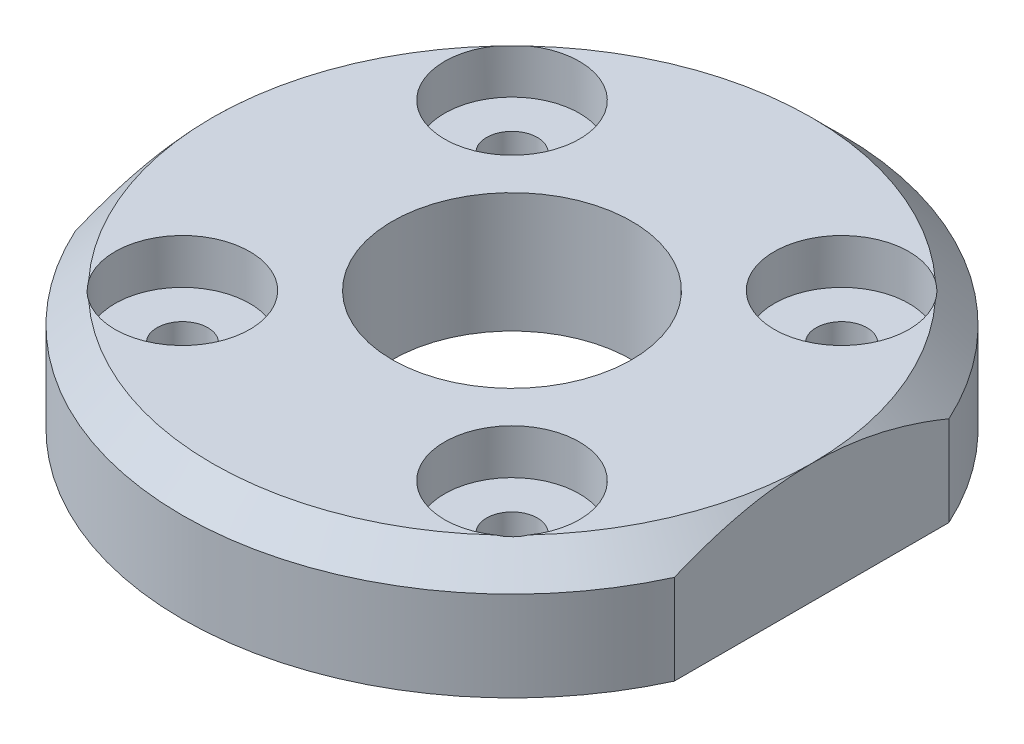
ISO-10303-21;
HEADER;
FILE_DESCRIPTION(('STEP AP214'),'2;1');
FILE_NAME('part.step','',(''),(''),'','','');
FILE_SCHEMA(('AUTOMOTIVE_DESIGN { 1 0 10303 214 1 1 1 1 }'));
ENDSEC;
DATA;
#1=APPLICATION_CONTEXT('core data for automotive mechanical design processes');
#2=APPLICATION_PROTOCOL_DEFINITION('international standard','automotive_design',2000,#1);
#3=PRODUCT_CONTEXT('',#1,'mechanical');
#4=PRODUCT('Part','Part','',(#3));
#5=PRODUCT_RELATED_PRODUCT_CATEGORY('part','',(#4));
#6=PRODUCT_DEFINITION_FORMATION('','',#4);
#7=PRODUCT_DEFINITION_CONTEXT('part definition',#1,'design');
#8=PRODUCT_DEFINITION('design','',#6,#7);
#9=PRODUCT_DEFINITION_SHAPE('','',#8);
#10=(LENGTH_UNIT() NAMED_UNIT(*) SI_UNIT(.MILLI.,.METRE.));
#11=(NAMED_UNIT(*) PLANE_ANGLE_UNIT() SI_UNIT($,.RADIAN.));
#12=(NAMED_UNIT(*) SI_UNIT($,.STERADIAN.) SOLID_ANGLE_UNIT());
#13=UNCERTAINTY_MEASURE_WITH_UNIT(LENGTH_MEASURE(1.E-05),#10,'distance_accuracy_value','');
#14=(GEOMETRIC_REPRESENTATION_CONTEXT(3) GLOBAL_UNCERTAINTY_ASSIGNED_CONTEXT((#13)) GLOBAL_UNIT_ASSIGNED_CONTEXT((#10,
#11,#12)) REPRESENTATION_CONTEXT('',''));
#15=CARTESIAN_POINT('',(0.,0.,0.));
#16=DIRECTION('',(0.,0.,1.));
#17=DIRECTION('',(1.,0.,0.));
#18=AXIS2_PLACEMENT_3D('',#15,#16,#17);
#19=CARTESIAN_POINT('',(0.,0.,0.));
#20=DIRECTION('',(0.,1.,0.));
#21=DIRECTION('',(0.,0.,1.));
#22=AXIS2_PLACEMENT_3D('',#19,#20,#21);
#23=PLANE('',#22);
#24=CARTESIAN_POINT('',(-11.,0.,-11.));
#25=DIRECTION('',(0.,1.,0.));
#26=DIRECTION('',(0.,0.,1.));
#27=AXIS2_PLACEMENT_3D('',#24,#25,#26);
#28=CIRCLE('',#27,1.7);
#29=CARTESIAN_POINT('',(-11.,0.,-9.3));
#30=VERTEX_POINT('',#29);
#31=EDGE_CURVE('E210',#30,#30,#28,.T.);
#32=ORIENTED_EDGE('',*,*,#31,.T.);
#33=EDGE_LOOP('',(#32));
#34=FACE_BOUND('',#33,.T.);
#35=CARTESIAN_POINT('',(11.,0.,-11.));
#36=DIRECTION('',(0.,1.,0.));
#37=DIRECTION('',(0.,0.,1.));
#38=AXIS2_PLACEMENT_3D('',#35,#36,#37);
#39=CIRCLE('',#38,1.7);
#40=CARTESIAN_POINT('',(11.,0.,-9.3));
#41=VERTEX_POINT('',#40);
#42=EDGE_CURVE('E220',#41,#41,#39,.T.);
#43=ORIENTED_EDGE('',*,*,#42,.T.);
#44=EDGE_LOOP('',(#43));
#45=FACE_BOUND('',#44,.T.);
#46=CARTESIAN_POINT('',(11.,0.,11.));
#47=DIRECTION('',(0.,1.,0.));
#48=DIRECTION('',(0.,0.,1.));
#49=AXIS2_PLACEMENT_3D('',#46,#47,#48);
#50=CIRCLE('',#49,1.7);
#51=CARTESIAN_POINT('',(11.,0.,12.7));
#52=VERTEX_POINT('',#51);
#53=EDGE_CURVE('E229',#52,#52,#50,.T.);
#54=ORIENTED_EDGE('',*,*,#53,.T.);
#55=EDGE_LOOP('',(#54));
#56=FACE_BOUND('',#55,.T.);
#57=CARTESIAN_POINT('',(-11.,0.,11.));
#58=DIRECTION('',(0.,1.,0.));
#59=DIRECTION('',(0.,0.,1.));
#60=AXIS2_PLACEMENT_3D('',#57,#58,#59);
#61=CIRCLE('',#60,1.7);
#62=CARTESIAN_POINT('',(-11.,0.,12.7));
#63=VERTEX_POINT('',#62);
#64=EDGE_CURVE('E157',#63,#63,#61,.T.);
#65=ORIENTED_EDGE('',*,*,#64,.T.);
#66=EDGE_LOOP('',(#65));
#67=FACE_BOUND('',#66,.T.);
#68=CARTESIAN_POINT('',(0.,0.,0.));
#69=DIRECTION('',(0.,1.,0.));
#70=DIRECTION('',(0.,0.,1.));
#71=AXIS2_PLACEMENT_3D('',#68,#69,#70);
#72=CIRCLE('',#71,8.);
#73=CARTESIAN_POINT('',(0.,0.,8.));
#74=VERTEX_POINT('',#73);
#75=EDGE_CURVE('E141',#74,#74,#72,.T.);
#76=ORIENTED_EDGE('',*,*,#75,.T.);
#77=EDGE_LOOP('',(#76));
#78=FACE_BOUND('',#77,.T.);
#79=DIRECTION('',(0.,0.,-1.));
#80=VECTOR('',#79,1.);
#81=CARTESIAN_POINT('',(-20.,0.,-27.1326164874552));
#82=LINE('',#81,#80);
#83=CARTESIAN_POINT('',(-20.,0.,9.16515138991169));
#84=VERTEX_POINT('',#83);
#85=CARTESIAN_POINT('',(-20.,0.,-9.16515138991169));
#86=VERTEX_POINT('',#85);
#87=EDGE_CURVE('E120',#84,#86,#82,.T.);
#88=ORIENTED_EDGE('',*,*,#87,.T.);
#89=CARTESIAN_POINT('',(0.,0.,0.));
#90=DIRECTION('',(0.,1.,0.));
#91=DIRECTION('',(0.,0.,1.));
#92=AXIS2_PLACEMENT_3D('',#89,#90,#91);
#93=CIRCLE('',#92,22.);
#94=CARTESIAN_POINT('',(20.,0.,-9.16515138991167));
#95=VERTEX_POINT('',#94);
#96=EDGE_CURVE('E127',#95,#86,#93,.T.);
#97=ORIENTED_EDGE('',*,*,#96,.F.);
#98=DIRECTION('',(0.,0.,1.));
#99=VECTOR('',#98,1.);
#100=CARTESIAN_POINT('',(20.,0.,-27.1326164874552));
#101=LINE('',#100,#99);
#102=CARTESIAN_POINT('',(20.,0.,9.16515138991167));
#103=VERTEX_POINT('',#102);
#104=EDGE_CURVE('E112',#95,#103,#101,.T.);
#105=ORIENTED_EDGE('',*,*,#104,.T.);
#106=EDGE_CURVE('E133',#84,#103,#93,.T.);
#107=ORIENTED_EDGE('',*,*,#106,.F.);
#108=EDGE_LOOP('',(#88,#97,#105,#107));
#109=FACE_BOUND('',#108,.T.);
#110=ADVANCED_FACE('F37',(#34,#45,#56,#67,#78,#109),#23,.F.);
#111=CARTESIAN_POINT('',(0.,8.,0.));
#112=DIRECTION('',(0.,-1.,0.));
#113=DIRECTION('',(0.,0.,-1.));
#114=AXIS2_PLACEMENT_3D('',#111,#112,#113);
#115=CYLINDRICAL_SURFACE('',#114,22.);
#116=DIRECTION('',(0.,-1.,0.));
#117=VECTOR('',#116,1.);
#118=CARTESIAN_POINT('',(-20.,8.,-9.16515138991168));
#119=LINE('',#118,#117);
#120=CARTESIAN_POINT('',(-20.,6.00000000000001,-9.16515138991168));
#121=VERTEX_POINT('',#120);
#122=EDGE_CURVE('E197',#121,#86,#119,.T.);
#123=ORIENTED_EDGE('',*,*,#122,.F.);
#124=CARTESIAN_POINT('',(0.,6.00000000000001,0.));
#125=DIRECTION('',(0.,1.,0.));
#126=DIRECTION('',(0.,0.,1.));
#127=AXIS2_PLACEMENT_3D('',#124,#125,#126);
#128=CIRCLE('',#127,22.);
#129=CARTESIAN_POINT('',(20.,6.00000000000001,-9.16515138991167));
#130=VERTEX_POINT('',#129);
#131=EDGE_CURVE('E129',#121,#130,#128,.F.);
#132=ORIENTED_EDGE('',*,*,#131,.T.);
#133=DIRECTION('',(0.,-1.,0.));
#134=VECTOR('',#133,1.);
#135=CARTESIAN_POINT('',(20.,8.,-9.16515138991167));
#136=LINE('',#135,#134);
#137=EDGE_CURVE('E58',#95,#130,#136,.F.);
#138=ORIENTED_EDGE('',*,*,#137,.F.);
#139=ORIENTED_EDGE('',*,*,#96,.T.);
#140=EDGE_LOOP('',(#123,#132,#138,#139));
#141=FACE_BOUND('',#140,.T.);
#142=ADVANCED_FACE('F126',(#141),#115,.T.);
#143=DIRECTION('',(0.,-1.,0.));
#144=VECTOR('',#143,1.);
#145=CARTESIAN_POINT('',(-20.,8.,9.16515138991168));
#146=LINE('',#145,#144);
#147=CARTESIAN_POINT('',(-20.,6.00000000000001,9.16515138991168));
#148=VERTEX_POINT('',#147);
#149=EDGE_CURVE('E66',#84,#148,#146,.F.);
#150=ORIENTED_EDGE('',*,*,#149,.F.);
#151=ORIENTED_EDGE('',*,*,#106,.T.);
#152=DIRECTION('',(0.,-1.,0.));
#153=VECTOR('',#152,1.);
#154=CARTESIAN_POINT('',(20.,8.,9.16515138991167));
#155=LINE('',#154,#153);
#156=CARTESIAN_POINT('',(20.,6.00000000000002,9.16515138991167));
#157=VERTEX_POINT('',#156);
#158=EDGE_CURVE('E115',#157,#103,#155,.T.);
#159=ORIENTED_EDGE('',*,*,#158,.F.);
#160=EDGE_CURVE('E145',#157,#148,#128,.F.);
#161=ORIENTED_EDGE('',*,*,#160,.T.);
#162=EDGE_LOOP('',(#150,#151,#159,#161));
#163=FACE_BOUND('',#162,.T.);
#164=ADVANCED_FACE('F187',(#163),#115,.T.);
#165=CARTESIAN_POINT('',(0.,8.,0.));
#166=DIRECTION('',(0.,-1.,0.));
#167=DIRECTION('',(0.,0.,-1.));
#168=AXIS2_PLACEMENT_3D('',#165,#166,#167);
#169=CONICAL_SURFACE('',#168,20.,0.785398163397448);
#170=ORIENTED_EDGE('',*,*,#131,.F.);
#171=CARTESIAN_POINT('',(-20.,2.89207263716591,-15.1791968317613));
#172=CARTESIAN_POINT('',(-20.,3.11743132341118,-14.806376874501));
#173=CARTESIAN_POINT('',(-20.,3.33899370684409,-14.4312261788306));
#174=CARTESIAN_POINT('',(-20.,3.77335041971191,-13.6757640024392));
#175=CARTESIAN_POINT('',(-20.,3.98614255033087,-13.2954512589154));
#176=CARTESIAN_POINT('',(-20.,4.40254146675204,-12.5277439442489));
#177=CARTESIAN_POINT('',(-20.,4.60610596805788,-12.1403263550201));
#178=CARTESIAN_POINT('',(-20.,5.00157857932182,-11.3596083907334));
#179=CARTESIAN_POINT('',(-20.,5.19348745879363,-10.9663084061773));
#180=CARTESIAN_POINT('',(-20.,5.56752592857174,-10.1657987573753));
#181=CARTESIAN_POINT('',(-20.,5.74939622406038,-9.75846706894974));
#182=CARTESIAN_POINT('',(-20.,6.09720282389024,-8.93706222695268));
#183=CARTESIAN_POINT('',(-20.,6.26313771782975,-8.5229884804451));
#184=CARTESIAN_POINT('',(-20.,6.73308142143161,-7.27173018647817));
#185=CARTESIAN_POINT('',(-20.,7.01000167406303,-6.42389528703828));
#186=CARTESIAN_POINT('',(-20.,7.37404837860108,-5.06560721031782));
#187=CARTESIAN_POINT('',(-20.,7.49200460306922,-4.56331615536337));
#188=CARTESIAN_POINT('',(-20.,7.69313272789396,-3.55167088583208));
#189=CARTESIAN_POINT('',(-20.,7.77630293768696,-3.04231632921907));
#190=CARTESIAN_POINT('',(-20.,7.90419964888527,-2.0234405535724));
#191=CARTESIAN_POINT('',(-20.,7.94926593859624,-1.51396222667464));
#192=CARTESIAN_POINT('',(-20.,8.00041845914456,-0.49297071485993));
#193=CARTESIAN_POINT('',(-20.,8.00650378913915,0.0185425168099394));
#194=CARTESIAN_POINT('',(-20.,7.98510461044872,0.827765351388666));
#195=CARTESIAN_POINT('',(-20.,7.97053503985032,1.1258746258079));
#196=CARTESIAN_POINT('',(-20.,7.92827248720929,1.72116554828182));
#197=CARTESIAN_POINT('',(-20.,7.90057912008296,2.01834716885933));
#198=CARTESIAN_POINT('',(-20.,7.79830237238332,2.90773928855317));
#199=CARTESIAN_POINT('',(-20.,7.70452144626838,3.49782873224832));
#200=CARTESIAN_POINT('',(-20.,7.46887683999057,4.67599997680544));
#201=CARTESIAN_POINT('',(-20.,7.32641119486252,5.26395869768148));
#202=CARTESIAN_POINT('',(-20.,6.99984743435779,6.42794961505244));
#203=CARTESIAN_POINT('',(-20.,6.81575685714171,7.00398395042867));
#204=CARTESIAN_POINT('',(-20.,6.37223005198841,8.25641336359949));
#205=CARTESIAN_POINT('',(-20.,6.10509181411185,8.93006187562903));
#206=CARTESIAN_POINT('',(-20.,5.52992418999876,10.2598262229413));
#207=CARTESIAN_POINT('',(-20.,5.22187482773227,10.9159333038991));
#208=CARTESIAN_POINT('',(-20.,4.57217165041683,12.2139206594634));
#209=CARTESIAN_POINT('',(-20.,4.23040843943256,12.8557457468395));
#210=CARTESIAN_POINT('',(-20.,3.52086379818624,14.1246124924728));
#211=CARTESIAN_POINT('',(-20.,3.15308666669254,14.7516565705467));
#212=CARTESIAN_POINT('',(-20.,2.41327644768557,15.9656383822411));
#213=CARTESIAN_POINT('',(-20.,2.04214249986242,16.5531268948496));
#214=CARTESIAN_POINT('',(-20.,1.28425592323255,17.7179732206919));
#215=CARTESIAN_POINT('',(-20.,0.897502047959991,18.2953302201391));
#216=CARTESIAN_POINT('',(-20.,0.114416522547853,19.4364748216122));
#217=CARTESIAN_POINT('',(-20.,-0.28180934436011,20.0003351865517));
#218=CARTESIAN_POINT('',(-20.,-0.883967717553222,20.8403843532339));
#219=CARTESIAN_POINT('',(-20.,-1.0859634761424,21.119407685346));
#220=CARTESIAN_POINT('',(-20.,-1.49236180998181,21.6756877501043));
#221=CARTESIAN_POINT('',(-20.,-1.69676433603197,21.9529445186854));
#222=CARTESIAN_POINT('',(-20.,-1.90226644929818,22.2293845799839));
#223=B_SPLINE_CURVE_WITH_KNOTS('',3,(#171,#172,#173,#174,#175,#176,#177,#178,#179,#180,#181,
#182,#183,#184,#185,#186,#187,#188,#189,#190,#191,#192,#193,#194,#195,#196,#197,#198,#199,#200,
#201,#202,#203,#204,#205,#206,#207,#208,#209,#210,#211,#212,#213,#214,#215,#216,#217,#218,#219,
#220,#221,#222),.UNSPECIFIED.,.F.,.F.,(4,2,2,2,2,2,2,2,2,2,2,2,2,2,2,2,2,2,2,2,2,2,2,2,2,4),(0.,
1.3069393903593,2.61420447851268,3.92695440804231,5.23961757432271,6.57754409800536,
7.91558892922459,10.5863271586001,12.1331904331278,13.6801288748451,15.2131226071205,
16.7461517664696,17.6412801011057,18.5364347025831,20.3266491372566,22.1398516362127,
23.9527260318109,26.1250476477894,28.2984338888766,30.4791201389371,32.6594468713818,
34.7438474979137,36.8284147889654,38.8957265547773,39.9291118473825,40.9624760516718),.UNSPECIFIED.);
#224=CARTESIAN_POINT('',(-20.,8.00000000000001,0.));
#225=VERTEX_POINT('',#224);
#226=EDGE_CURVE('E12',#121,#225,#223,.T.);
#227=ORIENTED_EDGE('',*,*,#226,.T.);
#228=CARTESIAN_POINT('',(0.,8.,0.));
#229=DIRECTION('',(0.,1.,0.));
#230=DIRECTION('',(0.,0.,1.));
#231=AXIS2_PLACEMENT_3D('',#228,#229,#230);
#232=CIRCLE('',#231,20.);
#233=CARTESIAN_POINT('',(-14.6997436367092,8.,-13.5616199996544));
#234=VERTEX_POINT('',#233);
#235=EDGE_CURVE('E135',#234,#225,#232,.T.);
#236=ORIENTED_EDGE('',*,*,#235,.F.);
#237=CARTESIAN_POINT('',(-12.5564186621504,8.2672570903301,-15.2222696441736));
#238=CARTESIAN_POINT('',(-12.6429099786499,8.23681051057182,-15.1903971363521));
#239=CARTESIAN_POINT('',(-12.7290204820913,8.20826101278789,-15.1556265698283));
#240=CARTESIAN_POINT('',(-12.8999797576403,8.15518471659068,-15.0802921551357));
#241=CARTESIAN_POINT('',(-12.9848279977951,8.1306595727931,-15.03972593684));
#242=CARTESIAN_POINT('',(-13.1529385836893,8.08581980154273,-14.95270096749));
#243=CARTESIAN_POINT('',(-13.2361955084826,8.06551781723818,-14.9062251752055));
#244=CARTESIAN_POINT('',(-13.4002794886541,8.02942974860471,-14.8076000497793));
#245=CARTESIAN_POINT('',(-13.4811068915129,8.01364301570865,-14.7554515329502));
#246=CARTESIAN_POINT('',(-13.6426793238895,7.98626411982456,-14.6436583626195));
#247=CARTESIAN_POINT('',(-13.7233126857109,7.97484696376055,-14.5838089741521));
#248=CARTESIAN_POINT('',(-13.8807294403846,7.95719438098347,-14.4585423270114));
#249=CARTESIAN_POINT('',(-13.9575129403414,7.95095881004159,-14.3931252233705));
#250=CARTESIAN_POINT('',(-14.1064391224374,7.943758600589,-14.2573247953016));
#251=CARTESIAN_POINT('',(-14.1785936767192,7.94277989780442,-14.186955232901));
#252=CARTESIAN_POINT('',(-14.3179297942188,7.94606877472912,-14.0416226783286));
#253=CARTESIAN_POINT('',(-14.3851136757151,7.95033389220439,-13.9666618576798));
#254=CARTESIAN_POINT('',(-14.4940682372063,7.96191937486555,-13.8365978697961));
#255=CARTESIAN_POINT('',(-14.5372560376752,7.96788112232982,-13.7825501028817));
#256=CARTESIAN_POINT('',(-14.6209448276274,7.98223145353413,-13.672737274714));
#257=CARTESIAN_POINT('',(-14.6614461385265,7.99061974631249,-13.6169724200688));
#258=CARTESIAN_POINT('',(-14.7656844045199,8.01615031141279,-13.4663151747607));
#259=CARTESIAN_POINT('',(-14.826964963451,8.03540467066666,-13.3700606197481));
#260=CARTESIAN_POINT('',(-14.9415139828214,8.08022966946816,-13.1742473451747));
#261=CARTESIAN_POINT('',(-14.9947768525579,8.10580468385547,-13.0746863785737));
#262=CARTESIAN_POINT('',(-15.0932785258516,8.163000982069,-12.8728901341668));
#263=CARTESIAN_POINT('',(-15.1384880486998,8.1946434944,-12.7706465882557));
#264=CARTESIAN_POINT('',(-15.2206566586128,8.26349651468595,-12.5647244212822));
#265=CARTESIAN_POINT('',(-15.2576131750094,8.30070875150192,-12.4610453637326));
#266=CARTESIAN_POINT('',(-15.3397040142605,8.40001111541401,-12.2014791416151));
#267=CARTESIAN_POINT('',(-15.3798143172906,8.46529080370895,-12.0451826984376));
#268=CARTESIAN_POINT('',(-15.4268085092359,8.57041865937451,-11.8121647459587));
#269=CARTESIAN_POINT('',(-15.4402557183851,8.60653520499017,-11.7349755953356));
#270=CARTESIAN_POINT('',(-15.4629944615008,8.68104181865556,-11.581130877084));
#271=CARTESIAN_POINT('',(-15.4722880841413,8.71943073299773,-11.5044750603979));
#272=CARTESIAN_POINT('',(-15.4795846495135,8.7588879710755,-11.4281604463785));
#273=B_SPLINE_CURVE_WITH_KNOTS('',3,(#237,#238,#239,#240,#241,#242,#243,#244,#245,#246,#247,
#248,#249,#250,#251,#252,#253,#254,#255,#256,#257,#258,#259,#260,#261,#262,#263,#264,#265,#266,
#267,#268,#269,#270,#271,#272),.UNSPECIFIED.,.F.,.F.,(4,2,2,2,2,2,2,2,2,2,2,2,2,2,2,2,2,4),(0.,
0.291189268640532,0.582497961569495,0.874666596718346,1.16679324389424,1.46963019947963,
1.77245872535137,2.07447665593232,2.37635282824202,2.5845619663566,2.79274614891533,
3.13935518990139,3.48620481144049,3.83429086864788,4.18248519786473,4.70324102413884,
4.96196186236162,5.22055245334422),.UNSPECIFIED.);
#274=CARTESIAN_POINT('',(-13.5616199996544,8.,-14.6997436367092));
#275=VERTEX_POINT('',#274);
#276=EDGE_CURVE('E272',#275,#234,#273,.T.);
#277=ORIENTED_EDGE('',*,*,#276,.F.);
#278=CARTESIAN_POINT('',(13.5616199996544,8.,-14.6997436367092));
#279=VERTEX_POINT('',#278);
#280=EDGE_CURVE('E461',#279,#275,#232,.T.);
#281=ORIENTED_EDGE('',*,*,#280,.F.);
#282=CARTESIAN_POINT('',(15.2222696441736,8.26725709033009,-12.5564186621504));
#283=CARTESIAN_POINT('',(15.1903971363521,8.23681051057182,-12.6429099786499));
#284=CARTESIAN_POINT('',(15.1556265698283,8.20826101278789,-12.7290204820913));
#285=CARTESIAN_POINT('',(15.0802921551357,8.15518471659068,-12.8999797576403));
#286=CARTESIAN_POINT('',(15.03972593684,8.13065957279311,-12.9848279977951));
#287=CARTESIAN_POINT('',(14.95270096749,8.08581980154273,-13.1529385836893));
#288=CARTESIAN_POINT('',(14.9062251752055,8.06551781723818,-13.2361955084826));
#289=CARTESIAN_POINT('',(14.8076000497794,8.02942974860472,-13.4002794886541));
#290=CARTESIAN_POINT('',(14.7554515329502,8.01364301570866,-13.4811068915129));
#291=CARTESIAN_POINT('',(14.6436583626195,7.98626411982456,-13.6426793238895));
#292=CARTESIAN_POINT('',(14.5838089741521,7.97484696376055,-13.7233126857109));
#293=CARTESIAN_POINT('',(14.4585423270114,7.95719438098347,-13.8807294403845));
#294=CARTESIAN_POINT('',(14.3931252233705,7.95095881004158,-13.9575129403413));
#295=CARTESIAN_POINT('',(14.2573247953016,7.943758600589,-14.1064391224374));
#296=CARTESIAN_POINT('',(14.186955232901,7.94277989780442,-14.1785936767192));
#297=CARTESIAN_POINT('',(14.0416226783287,7.94606877472912,-14.3179297942188));
#298=CARTESIAN_POINT('',(13.9666618576798,7.95033389220439,-14.385113675715));
#299=CARTESIAN_POINT('',(13.8365978697962,7.96191937486555,-14.4940682372063));
#300=CARTESIAN_POINT('',(13.7825501028817,7.96788112232981,-14.5372560376752));
#301=CARTESIAN_POINT('',(13.672737274714,7.98223145353412,-14.6209448276274));
#302=CARTESIAN_POINT('',(13.6169724200688,7.99061974631249,-14.6614461385265));
#303=CARTESIAN_POINT('',(13.4663151747607,8.01615031141279,-14.7656844045199));
#304=CARTESIAN_POINT('',(13.370060619748,8.03540467066666,-14.8269649634511));
#305=CARTESIAN_POINT('',(13.1742473451747,8.08022966946816,-14.9415139828214));
#306=CARTESIAN_POINT('',(13.0746863785737,8.10580468385548,-14.9947768525579));
#307=CARTESIAN_POINT('',(12.8728901341668,8.16300098206901,-15.0932785258517));
#308=CARTESIAN_POINT('',(12.7706465882556,8.1946434944,-15.1384880486998));
#309=CARTESIAN_POINT('',(12.5647244212821,8.26349651468595,-15.2206566586129));
#310=CARTESIAN_POINT('',(12.4610453637325,8.30070875150192,-15.2576131750094));
#311=CARTESIAN_POINT('',(12.2014791416151,8.40001111541401,-15.3397040142605));
#312=CARTESIAN_POINT('',(12.0451826984375,8.46529080370895,-15.3798143172906));
#313=CARTESIAN_POINT('',(11.8121647459587,8.5704186593745,-15.4268085092359));
#314=CARTESIAN_POINT('',(11.7349755953356,8.60653520499017,-15.4402557183851));
#315=CARTESIAN_POINT('',(11.581130877084,8.68104181865556,-15.4629944615008));
#316=CARTESIAN_POINT('',(11.5044750603979,8.71943073299773,-15.4722880841413));
#317=CARTESIAN_POINT('',(11.4281604463785,8.7588879710755,-15.4795846495135));
#318=B_SPLINE_CURVE_WITH_KNOTS('',3,(#282,#283,#284,#285,#286,#287,#288,#289,#290,#291,#292,
#293,#294,#295,#296,#297,#298,#299,#300,#301,#302,#303,#304,#305,#306,#307,#308,#309,#310,#311,
#312,#313,#314,#315,#316,#317),.UNSPECIFIED.,.F.,.F.,(4,2,2,2,2,2,2,2,2,2,2,2,2,2,2,2,2,4),(0.,
0.291189268640524,0.582497961569483,0.87466659671833,1.16679324389422,1.46963019947961,
1.77245872535134,2.07447665593229,2.37635282824199,2.5845619663566,2.79274614891535,
3.13935518990141,3.48620481144051,3.8342908686479,4.18248519786475,4.70324102413885,
4.96196186236163,5.22055245334422),.UNSPECIFIED.);
#319=CARTESIAN_POINT('',(14.6997436367092,8.,-13.5616199996544));
#320=VERTEX_POINT('',#319);
#321=EDGE_CURVE('E265',#320,#279,#318,.T.);
#322=ORIENTED_EDGE('',*,*,#321,.F.);
#323=CARTESIAN_POINT('',(20.,8.00000000000001,0.));
#324=VERTEX_POINT('',#323);
#325=EDGE_CURVE('E137',#324,#320,#232,.T.);
#326=ORIENTED_EDGE('',*,*,#325,.F.);
#327=CARTESIAN_POINT('',(20.,2.89207263716591,-15.1791968317613));
#328=CARTESIAN_POINT('',(20.,3.11743132341117,-14.806376874501));
#329=CARTESIAN_POINT('',(20.,3.33899370684408,-14.4312261788306));
#330=CARTESIAN_POINT('',(20.,3.77335041971191,-13.6757640024392));
#331=CARTESIAN_POINT('',(20.,3.98614255033087,-13.2954512589154));
#332=CARTESIAN_POINT('',(20.,4.40254146675204,-12.5277439442489));
#333=CARTESIAN_POINT('',(20.,4.60610596805787,-12.1403263550201));
#334=CARTESIAN_POINT('',(20.,5.00157857932182,-11.3596083907334));
#335=CARTESIAN_POINT('',(20.,5.19348745879363,-10.9663084061773));
#336=CARTESIAN_POINT('',(20.,5.56752592857174,-10.1657987573753));
#337=CARTESIAN_POINT('',(20.,5.74939622406037,-9.75846706894974));
#338=CARTESIAN_POINT('',(20.,6.09720282389023,-8.93706222695268));
#339=CARTESIAN_POINT('',(20.,6.26313771782974,-8.5229884804451));
#340=CARTESIAN_POINT('',(20.,6.7330814214316,-7.27173018647817));
#341=CARTESIAN_POINT('',(20.,7.01000167406303,-6.42389528703828));
#342=CARTESIAN_POINT('',(20.,7.37404837860107,-5.06560721031781));
#343=CARTESIAN_POINT('',(20.,7.49200460306921,-4.56331615536336));
#344=CARTESIAN_POINT('',(20.,7.69313272789395,-3.55167088583207));
#345=CARTESIAN_POINT('',(20.,7.77630293768696,-3.04231632921907));
#346=CARTESIAN_POINT('',(20.,7.90419964888527,-2.0234405535724));
#347=CARTESIAN_POINT('',(20.,7.94926593859624,-1.51396222667463));
#348=CARTESIAN_POINT('',(20.,8.00041845914456,-0.492970714859927));
#349=CARTESIAN_POINT('',(20.,8.00650378913914,0.0185425168099428));
#350=CARTESIAN_POINT('',(20.,7.98510461044872,0.827765351388669));
#351=CARTESIAN_POINT('',(20.,7.97053503985031,1.1258746258079));
#352=CARTESIAN_POINT('',(20.,7.92827248720929,1.72116554828182));
#353=CARTESIAN_POINT('',(20.,7.90057912008296,2.01834716885933));
#354=CARTESIAN_POINT('',(20.,7.79830237238331,2.90773928855317));
#355=CARTESIAN_POINT('',(20.,7.70452144626838,3.49782873224832));
#356=CARTESIAN_POINT('',(20.,7.46887683999057,4.67599997680544));
#357=CARTESIAN_POINT('',(20.,7.32641119486251,5.26395869768148));
#358=CARTESIAN_POINT('',(20.,6.99984743435779,6.42794961505244));
#359=CARTESIAN_POINT('',(20.,6.8157568571417,7.00398395042868));
#360=CARTESIAN_POINT('',(20.,6.3722300519884,8.2564133635995));
#361=CARTESIAN_POINT('',(20.,6.10509181411184,8.93006187562904));
#362=CARTESIAN_POINT('',(20.,5.52992418999875,10.2598262229414));
#363=CARTESIAN_POINT('',(20.,5.22187482773226,10.9159333038991));
#364=CARTESIAN_POINT('',(20.,4.57217165041682,12.2139206594634));
#365=CARTESIAN_POINT('',(20.,4.23040843943255,12.8557457468395));
#366=CARTESIAN_POINT('',(20.,3.52086379818623,14.1246124924728));
#367=CARTESIAN_POINT('',(20.,3.15308666669253,14.7516565705467));
#368=CARTESIAN_POINT('',(20.,2.41327644768556,15.9656383822411));
#369=CARTESIAN_POINT('',(20.,2.04214249986241,16.5531268948497));
#370=CARTESIAN_POINT('',(20.,1.28425592323253,17.7179732206919));
#371=CARTESIAN_POINT('',(20.,0.897502047959975,18.2953302201391));
#372=CARTESIAN_POINT('',(20.,0.114416522547838,19.4364748216122));
#373=CARTESIAN_POINT('',(20.,-0.281809344360124,20.0003351865517));
#374=CARTESIAN_POINT('',(20.,-0.88396771755324,20.8403843532339));
#375=CARTESIAN_POINT('',(20.,-1.08596347614242,21.119407685346));
#376=CARTESIAN_POINT('',(20.,-1.49236180998183,21.6756877501043));
#377=CARTESIAN_POINT('',(20.,-1.69676433603199,21.9529445186854));
#378=CARTESIAN_POINT('',(20.,-1.9022664492982,22.2293845799839));
#379=B_SPLINE_CURVE_WITH_KNOTS('',3,(#327,#328,#329,#330,#331,#332,#333,#334,#335,#336,#337,
#338,#339,#340,#341,#342,#343,#344,#345,#346,#347,#348,#349,#350,#351,#352,#353,#354,#355,#356,
#357,#358,#359,#360,#361,#362,#363,#364,#365,#366,#367,#368,#369,#370,#371,#372,#373,#374,#375,
#376,#377,#378),.UNSPECIFIED.,.F.,.F.,(4,2,2,2,2,2,2,2,2,2,2,2,2,2,2,2,2,2,2,2,2,2,2,2,2,4),(0.,
1.3069393903593,2.61420447851267,3.9269544080423,5.2396175743227,6.57754409800535,
7.91558892922459,10.5863271586001,12.1331904331278,13.6801288748451,15.2131226071205,
16.7461517664696,17.6412801011057,18.5364347025831,20.3266491372566,22.1398516362127,
23.9527260318109,26.1250476477894,28.2984338888766,30.4791201389371,32.6594468713818,
34.7438474979137,36.8284147889654,38.8957265547773,39.9291118473825,40.9624760516718),.UNSPECIFIED.);
#380=EDGE_CURVE('E434',#324,#130,#379,.F.);
#381=ORIENTED_EDGE('',*,*,#380,.T.);
#382=EDGE_LOOP('',(#170,#227,#236,#277,#281,#322,#326,#381));
#383=FACE_BOUND('',#382,.T.);
#384=ADVANCED_FACE('F39',(#383),#169,.T.);
#385=CARTESIAN_POINT('',(-14.6997436367092,8.,13.5616199996544));
#386=VERTEX_POINT('',#385);
#387=EDGE_CURVE('E132',#225,#386,#232,.T.);
#388=ORIENTED_EDGE('',*,*,#387,.F.);
#389=EDGE_CURVE('E42',#225,#148,#223,.T.);
#390=ORIENTED_EDGE('',*,*,#389,.T.);
#391=ORIENTED_EDGE('',*,*,#160,.F.);
#392=EDGE_CURVE('E440',#157,#324,#379,.F.);
#393=ORIENTED_EDGE('',*,*,#392,.T.);
#394=CARTESIAN_POINT('',(14.6997436367092,8.,13.5616199996544));
#395=VERTEX_POINT('',#394);
#396=EDGE_CURVE('E146',#395,#324,#232,.T.);
#397=ORIENTED_EDGE('',*,*,#396,.F.);
#398=CARTESIAN_POINT('',(11.4281604463785,8.7588879710755,15.4795846495135));
#399=CARTESIAN_POINT('',(11.5424718918299,8.6997756826289,15.4686698007617));
#400=CARTESIAN_POINT('',(11.6576374202965,8.64303405191991,15.4532351006668));
#401=CARTESIAN_POINT('',(11.8889921002396,8.53479941059913,15.4128766227845));
#402=CARTESIAN_POINT('',(12.0051826014612,8.48331499928207,15.387937604225));
#403=CARTESIAN_POINT('',(12.237340108417,8.38637516688069,15.3282021336183));
#404=CARTESIAN_POINT('',(12.3533071704937,8.34091008379331,15.2934217671878));
#405=CARTESIAN_POINT('',(12.5840413680669,8.25656557139269,15.2137507112228));
#406=CARTESIAN_POINT('',(12.6988094801227,8.21768031370345,15.1688690523625));
#407=CARTESIAN_POINT('',(12.9412870885436,8.14231588677007,15.0621679719669));
#408=CARTESIAN_POINT('',(13.0686755854051,8.10685329836356,14.9988863447039));
#409=CARTESIAN_POINT('',(13.3186607414638,8.04589432460079,14.8593119193398));
#410=CARTESIAN_POINT('',(13.4412576858603,8.02039734526362,14.7830198970877));
#411=CARTESIAN_POINT('',(13.6426107381787,7.98627452056342,14.6437082985009));
#412=CARTESIAN_POINT('',(13.7231588801646,7.97486832796154,14.5839239571836));
#413=CARTESIAN_POINT('',(13.8804103673898,7.95722605946899,14.4588036175017));
#414=CARTESIAN_POINT('',(13.9571144748113,7.95098895482808,14.3934687266607));
#415=CARTESIAN_POINT('',(14.1060556591033,7.94376633197982,14.2576941736925));
#416=CARTESIAN_POINT('',(14.1782947851246,7.94277838677681,14.1872568859768));
#417=CARTESIAN_POINT('',(14.3177888316112,7.94605992523713,14.0417797691141));
#418=CARTESIAN_POINT('',(14.385046209205,7.95032679853268,13.9667422427574));
#419=CARTESIAN_POINT('',(14.4940866860151,7.96192128126708,13.8365759519042));
#420=CARTESIAN_POINT('',(14.5372916922836,7.96788591644026,13.7825057267591));
#421=CARTESIAN_POINT('',(14.6209787981203,7.98223859867122,13.6726902909188));
#422=CARTESIAN_POINT('',(14.6614634480402,7.99062433572328,13.6169467219971));
#423=CARTESIAN_POINT('',(14.7552015430608,8.0135823068209,13.4814671741407));
#424=CARTESIAN_POINT('',(14.8071331157465,8.02928865870189,13.4010027152506));
#425=CARTESIAN_POINT('',(14.9053950013544,8.06518465106743,13.2376296318899));
#426=CARTESIAN_POINT('',(14.9517217590455,8.08537711437875,13.1547194971227));
#427=CARTESIAN_POINT('',(15.0388641329434,8.13015492403015,12.9866012238807));
#428=CARTESIAN_POINT('',(15.0796480048268,8.15476384233601,12.9013829471312));
#429=CARTESIAN_POINT('',(15.1553485132545,8.2080324949127,12.7297094937848));
#430=CARTESIAN_POINT('',(15.1902702213705,8.23668868779763,12.6432554573018));
#431=CARTESIAN_POINT('',(15.2222696441736,8.2672570903301,12.5564186621504));
#432=B_SPLINE_CURVE_WITH_KNOTS('',3,(#398,#399,#400,#401,#402,#403,#404,#405,#406,#407,#408,
#409,#410,#411,#412,#413,#414,#415,#416,#417,#418,#419,#420,#421,#422,#423,#424,#425,#426,#427,
#428,#429,#430,#431),.UNSPECIFIED.,.F.,.F.,(4,2,2,2,2,2,2,2,2,2,2,2,2,2,2,2,4),(0.,
0.387435292546676,0.775494494043802,1.16292304340094,1.55000659331305,1.98883674400725,
2.42764073508706,2.73018326603423,3.03266557059334,3.33500800758412,3.63720031442016,
3.84549601682484,4.05359363458544,4.34441692256779,4.63542372821004,4.92803260152208,
5.22038700879297),.UNSPECIFIED.);
#433=CARTESIAN_POINT('',(13.5616199996544,8.,14.6997436367092));
#434=VERTEX_POINT('',#433);
#435=EDGE_CURVE('E156',#434,#395,#432,.T.);
#436=ORIENTED_EDGE('',*,*,#435,.F.);
#437=CARTESIAN_POINT('',(-13.5616199996544,8.,14.6997436367092));
#438=VERTEX_POINT('',#437);
#439=EDGE_CURVE('E138',#438,#434,#232,.T.);
#440=ORIENTED_EDGE('',*,*,#439,.F.);
#441=CARTESIAN_POINT('',(-15.4795846495135,8.7588879710755,11.4281604463785));
#442=CARTESIAN_POINT('',(-15.4686698007617,8.69977568262889,11.5424718918299));
#443=CARTESIAN_POINT('',(-15.4532351006668,8.64303405191991,11.6576374202965));
#444=CARTESIAN_POINT('',(-15.4128766227845,8.53479941059913,11.8889921002396));
#445=CARTESIAN_POINT('',(-15.387937604225,8.48331499928207,12.0051826014612));
#446=CARTESIAN_POINT('',(-15.3282021336183,8.38637516688068,12.237340108417));
#447=CARTESIAN_POINT('',(-15.2934217671878,8.34091008379331,12.3533071704937));
#448=CARTESIAN_POINT('',(-15.2137507112228,8.25656557139268,12.5840413680669));
#449=CARTESIAN_POINT('',(-15.1688690523625,8.21768031370345,12.6988094801227));
#450=CARTESIAN_POINT('',(-15.0621679719669,8.14231588677007,12.9412870885436));
#451=CARTESIAN_POINT('',(-14.9988863447039,8.10685329836356,13.0686755854051));
#452=CARTESIAN_POINT('',(-14.8593119193398,8.04589432460079,13.3186607414638));
#453=CARTESIAN_POINT('',(-14.7830198970878,8.02039734526362,13.4412576858602));
#454=CARTESIAN_POINT('',(-14.6437082985009,7.98627452056342,13.6426107381787));
#455=CARTESIAN_POINT('',(-14.5839239571836,7.97486832796154,13.7231588801645));
#456=CARTESIAN_POINT('',(-14.4588036175017,7.95722605946899,13.8804103673897));
#457=CARTESIAN_POINT('',(-14.3934687266608,7.95098895482808,13.9571144748113));
#458=CARTESIAN_POINT('',(-14.2576941736926,7.94376633197982,14.1060556591033));
#459=CARTESIAN_POINT('',(-14.1872568859768,7.94277838677681,14.1782947851246));
#460=CARTESIAN_POINT('',(-14.0417797691141,7.94605992523713,14.3177888316112));
#461=CARTESIAN_POINT('',(-13.9667422427574,7.95032679853267,14.385046209205));
#462=CARTESIAN_POINT('',(-13.8365759519042,7.96192128126707,14.4940866860151));
#463=CARTESIAN_POINT('',(-13.7825057267591,7.96788591644025,14.5372916922836));
#464=CARTESIAN_POINT('',(-13.6726902909188,7.98223859867122,14.6209787981203));
#465=CARTESIAN_POINT('',(-13.616946721997,7.99062433572328,14.6614634480402));
#466=CARTESIAN_POINT('',(-13.4814671741406,8.01358230682091,14.7552015430609));
#467=CARTESIAN_POINT('',(-13.4010027152506,8.0292886587019,14.8071331157466));
#468=CARTESIAN_POINT('',(-13.2376296318899,8.06518465106743,14.9053950013545));
#469=CARTESIAN_POINT('',(-13.1547194971227,8.08537711437875,14.9517217590455));
#470=CARTESIAN_POINT('',(-12.9866012238807,8.13015492403015,15.0388641329434));
#471=CARTESIAN_POINT('',(-12.9013829471311,8.15476384233601,15.0796480048269));
#472=CARTESIAN_POINT('',(-12.7297094937848,8.2080324949127,15.1553485132545));
#473=CARTESIAN_POINT('',(-12.6432554573018,8.23668868779763,15.1902702213705));
#474=CARTESIAN_POINT('',(-12.5564186621504,8.26725709033009,15.2222696441736));
#475=B_SPLINE_CURVE_WITH_KNOTS('',3,(#441,#442,#443,#444,#445,#446,#447,#448,#449,#450,#451,
#452,#453,#454,#455,#456,#457,#458,#459,#460,#461,#462,#463,#464,#465,#466,#467,#468,#469,#470,
#471,#472,#473,#474),.UNSPECIFIED.,.F.,.F.,(4,2,2,2,2,2,2,2,2,2,2,2,2,2,2,2,4),(0.,
0.387435292546679,0.775494494043807,1.16292304340094,1.55000659331306,1.98883674400724,
2.42764073508703,2.7301832660342,3.03266557059331,3.33500800758409,3.63720031442013,
3.84549601682485,4.05359363458548,4.34441692256783,4.63542372821006,4.92803260152209,
5.22038700879297),.UNSPECIFIED.);
#476=EDGE_CURVE('E149',#386,#438,#475,.T.);
#477=ORIENTED_EDGE('',*,*,#476,.F.);
#478=EDGE_LOOP('',(#388,#390,#391,#393,#397,#436,#440,#477));
#479=FACE_BOUND('',#478,.T.);
#480=ADVANCED_FACE('F182',(#479),#169,.T.);
#481=CARTESIAN_POINT('',(0.,8.,0.));
#482=DIRECTION('',(0.,1.,0.));
#483=DIRECTION('',(0.,0.,1.));
#484=AXIS2_PLACEMENT_3D('',#481,#482,#483);
#485=PLANE('',#484);
#486=CARTESIAN_POINT('',(-11.,8.,-11.));
#487=DIRECTION('',(0.,1.,0.));
#488=DIRECTION('',(0.,0.,1.));
#489=AXIS2_PLACEMENT_3D('',#486,#487,#488);
#490=CIRCLE('',#489,4.5);
#491=EDGE_CURVE('E199',#234,#275,#490,.T.);
#492=ORIENTED_EDGE('',*,*,#491,.F.);
#493=ORIENTED_EDGE('',*,*,#235,.T.);
#494=ORIENTED_EDGE('',*,*,#387,.T.);
#495=CARTESIAN_POINT('',(-11.,8.,11.));
#496=DIRECTION('',(0.,1.,0.));
#497=DIRECTION('',(0.,0.,1.));
#498=AXIS2_PLACEMENT_3D('',#495,#496,#497);
#499=CIRCLE('',#498,4.5);
#500=EDGE_CURVE('E230',#438,#386,#499,.T.);
#501=ORIENTED_EDGE('',*,*,#500,.F.);
#502=ORIENTED_EDGE('',*,*,#439,.T.);
#503=CARTESIAN_POINT('',(11.,8.,11.));
#504=DIRECTION('',(0.,1.,0.));
#505=DIRECTION('',(0.,0.,1.));
#506=AXIS2_PLACEMENT_3D('',#503,#504,#505);
#507=CIRCLE('',#506,4.5);
#508=EDGE_CURVE('E221',#395,#434,#507,.T.);
#509=ORIENTED_EDGE('',*,*,#508,.F.);
#510=ORIENTED_EDGE('',*,*,#396,.T.);
#511=ORIENTED_EDGE('',*,*,#325,.T.);
#512=CARTESIAN_POINT('',(11.,8.,-11.));
#513=DIRECTION('',(0.,1.,0.));
#514=DIRECTION('',(0.,0.,1.));
#515=AXIS2_PLACEMENT_3D('',#512,#513,#514);
#516=CIRCLE('',#515,4.5);
#517=EDGE_CURVE('E211',#279,#320,#516,.T.);
#518=ORIENTED_EDGE('',*,*,#517,.F.);
#519=ORIENTED_EDGE('',*,*,#280,.T.);
#520=EDGE_LOOP('',(#492,#493,#494,#501,#502,#509,#510,#511,#518,#519));
#521=FACE_BOUND('',#520,.T.);
#522=CARTESIAN_POINT('',(0.,8.,0.));
#523=DIRECTION('',(0.,1.,0.));
#524=DIRECTION('',(0.,0.,1.));
#525=AXIS2_PLACEMENT_3D('',#522,#523,#524);
#526=CIRCLE('',#525,8.);
#527=CARTESIAN_POINT('',(0.,8.,8.));
#528=VERTEX_POINT('',#527);
#529=EDGE_CURVE('E139',#528,#528,#526,.T.);
#530=ORIENTED_EDGE('',*,*,#529,.F.);
#531=EDGE_LOOP('',(#530));
#532=FACE_BOUND('',#531,.T.);
#533=ADVANCED_FACE('F178',(#521,#532),#485,.T.);
#534=CARTESIAN_POINT('',(0.,8.,0.));
#535=DIRECTION('',(0.,-1.,0.));
#536=DIRECTION('',(0.,0.,-1.));
#537=AXIS2_PLACEMENT_3D('',#534,#535,#536);
#538=CYLINDRICAL_SURFACE('',#537,8.);
#539=ORIENTED_EDGE('',*,*,#529,.T.);
#540=EDGE_LOOP('',(#539));
#541=FACE_BOUND('',#540,.T.);
#542=ORIENTED_EDGE('',*,*,#75,.F.);
#543=EDGE_LOOP('',(#542));
#544=FACE_BOUND('',#543,.T.);
#545=ADVANCED_FACE('F174',(#541,#544),#538,.F.);
#546=CARTESIAN_POINT('',(-11.,8.,11.));
#547=DIRECTION('',(0.,1.,0.));
#548=DIRECTION('',(0.,0.,1.));
#549=AXIS2_PLACEMENT_3D('',#546,#547,#548);
#550=CYLINDRICAL_SURFACE('',#549,1.7);
#551=CARTESIAN_POINT('',(-11.,5.,11.));
#552=DIRECTION('',(0.,1.,0.));
#553=DIRECTION('',(0.,0.,1.));
#554=AXIS2_PLACEMENT_3D('',#551,#552,#553);
#555=CIRCLE('',#554,1.7);
#556=CARTESIAN_POINT('',(-11.,5.,12.7));
#557=VERTEX_POINT('',#556);
#558=EDGE_CURVE('E236',#557,#557,#555,.T.);
#559=ORIENTED_EDGE('',*,*,#558,.T.);
#560=EDGE_LOOP('',(#559));
#561=FACE_BOUND('',#560,.T.);
#562=ORIENTED_EDGE('',*,*,#64,.F.);
#563=EDGE_LOOP('',(#562));
#564=FACE_BOUND('',#563,.T.);
#565=ADVANCED_FACE('F170',(#561,#564),#550,.F.);
#566=CARTESIAN_POINT('',(-9.3,5.,11.));
#567=DIRECTION('',(0.,-1.,0.));
#568=DIRECTION('',(0.,0.,-1.));
#569=AXIS2_PLACEMENT_3D('',#566,#567,#568);
#570=PLANE('',#569);
#571=ORIENTED_EDGE('',*,*,#558,.F.);
#572=EDGE_LOOP('',(#571));
#573=FACE_BOUND('',#572,.T.);
#574=CARTESIAN_POINT('',(-11.,5.,11.));
#575=DIRECTION('',(0.,1.,0.));
#576=DIRECTION('',(0.,0.,1.));
#577=AXIS2_PLACEMENT_3D('',#574,#575,#576);
#578=CIRCLE('',#577,4.5);
#579=CARTESIAN_POINT('',(-11.,5.,15.5));
#580=VERTEX_POINT('',#579);
#581=EDGE_CURVE('E233',#580,#580,#578,.T.);
#582=ORIENTED_EDGE('',*,*,#581,.T.);
#583=EDGE_LOOP('',(#582));
#584=FACE_BOUND('',#583,.T.);
#585=ADVANCED_FACE('F165',(#573,#584),#570,.F.);
#586=CARTESIAN_POINT('',(-11.,8.,11.));
#587=DIRECTION('',(0.,1.,0.));
#588=DIRECTION('',(0.,0.,1.));
#589=AXIS2_PLACEMENT_3D('',#586,#587,#588);
#590=CYLINDRICAL_SURFACE('',#589,4.5);
#591=ORIENTED_EDGE('',*,*,#476,.T.);
#592=ORIENTED_EDGE('',*,*,#500,.T.);
#593=EDGE_LOOP('',(#591,#592));
#594=FACE_BOUND('',#593,.T.);
#595=ORIENTED_EDGE('',*,*,#581,.F.);
#596=EDGE_LOOP('',(#595));
#597=FACE_BOUND('',#596,.T.);
#598=ADVANCED_FACE('F159',(#594,#597),#590,.F.);
#599=CARTESIAN_POINT('',(11.,8.,11.));
#600=DIRECTION('',(0.,1.,0.));
#601=DIRECTION('',(0.,0.,1.));
#602=AXIS2_PLACEMENT_3D('',#599,#600,#601);
#603=CYLINDRICAL_SURFACE('',#602,1.7);
#604=CARTESIAN_POINT('',(11.,5.,11.));
#605=DIRECTION('',(0.,1.,0.));
#606=DIRECTION('',(0.,0.,1.));
#607=AXIS2_PLACEMENT_3D('',#604,#605,#606);
#608=CIRCLE('',#607,1.7);
#609=CARTESIAN_POINT('',(11.,5.,12.7));
#610=VERTEX_POINT('',#609);
#611=EDGE_CURVE('E226',#610,#610,#608,.T.);
#612=ORIENTED_EDGE('',*,*,#611,.T.);
#613=EDGE_LOOP('',(#612));
#614=FACE_BOUND('',#613,.T.);
#615=ORIENTED_EDGE('',*,*,#53,.F.);
#616=EDGE_LOOP('',(#615));
#617=FACE_BOUND('',#616,.T.);
#618=ADVANCED_FACE('F164',(#614,#617),#603,.F.);
#619=CARTESIAN_POINT('',(12.7,5.,11.));
#620=DIRECTION('',(0.,-1.,0.));
#621=DIRECTION('',(0.,0.,-1.));
#622=AXIS2_PLACEMENT_3D('',#619,#620,#621);
#623=PLANE('',#622);
#624=ORIENTED_EDGE('',*,*,#611,.F.);
#625=EDGE_LOOP('',(#624));
#626=FACE_BOUND('',#625,.T.);
#627=CARTESIAN_POINT('',(11.,5.,11.));
#628=DIRECTION('',(0.,1.,0.));
#629=DIRECTION('',(0.,0.,1.));
#630=AXIS2_PLACEMENT_3D('',#627,#628,#629);
#631=CIRCLE('',#630,4.5);
#632=CARTESIAN_POINT('',(11.,5.,15.5));
#633=VERTEX_POINT('',#632);
#634=EDGE_CURVE('E223',#633,#633,#631,.T.);
#635=ORIENTED_EDGE('',*,*,#634,.T.);
#636=EDGE_LOOP('',(#635));
#637=FACE_BOUND('',#636,.T.);
#638=ADVANCED_FACE('F292',(#626,#637),#623,.F.);
#639=CARTESIAN_POINT('',(11.,8.,11.));
#640=DIRECTION('',(0.,1.,0.));
#641=DIRECTION('',(0.,0.,1.));
#642=AXIS2_PLACEMENT_3D('',#639,#640,#641);
#643=CYLINDRICAL_SURFACE('',#642,4.5);
#644=ORIENTED_EDGE('',*,*,#435,.T.);
#645=ORIENTED_EDGE('',*,*,#508,.T.);
#646=EDGE_LOOP('',(#644,#645));
#647=FACE_BOUND('',#646,.T.);
#648=ORIENTED_EDGE('',*,*,#634,.F.);
#649=EDGE_LOOP('',(#648));
#650=FACE_BOUND('',#649,.T.);
#651=ADVANCED_FACE('F288',(#647,#650),#643,.F.);
#652=CARTESIAN_POINT('',(11.,8.,-11.));
#653=DIRECTION('',(0.,1.,0.));
#654=DIRECTION('',(0.,0.,1.));
#655=AXIS2_PLACEMENT_3D('',#652,#653,#654);
#656=CYLINDRICAL_SURFACE('',#655,1.7);
#657=CARTESIAN_POINT('',(11.,5.,-11.));
#658=DIRECTION('',(0.,1.,0.));
#659=DIRECTION('',(0.,0.,1.));
#660=AXIS2_PLACEMENT_3D('',#657,#658,#659);
#661=CIRCLE('',#660,1.7);
#662=CARTESIAN_POINT('',(11.,5.,-9.3));
#663=VERTEX_POINT('',#662);
#664=EDGE_CURVE('E217',#663,#663,#661,.T.);
#665=ORIENTED_EDGE('',*,*,#664,.T.);
#666=EDGE_LOOP('',(#665));
#667=FACE_BOUND('',#666,.T.);
#668=ORIENTED_EDGE('',*,*,#42,.F.);
#669=EDGE_LOOP('',(#668));
#670=FACE_BOUND('',#669,.T.);
#671=ADVANCED_FACE('F285',(#667,#670),#656,.F.);
#672=CARTESIAN_POINT('',(12.7,5.,-11.));
#673=DIRECTION('',(0.,-1.,0.));
#674=DIRECTION('',(0.,0.,-1.));
#675=AXIS2_PLACEMENT_3D('',#672,#673,#674);
#676=PLANE('',#675);
#677=ORIENTED_EDGE('',*,*,#664,.F.);
#678=EDGE_LOOP('',(#677));
#679=FACE_BOUND('',#678,.T.);
#680=CARTESIAN_POINT('',(11.,5.,-11.));
#681=DIRECTION('',(0.,1.,0.));
#682=DIRECTION('',(0.,0.,1.));
#683=AXIS2_PLACEMENT_3D('',#680,#681,#682);
#684=CIRCLE('',#683,4.5);
#685=CARTESIAN_POINT('',(11.,5.,-6.5));
#686=VERTEX_POINT('',#685);
#687=EDGE_CURVE('E214',#686,#686,#684,.T.);
#688=ORIENTED_EDGE('',*,*,#687,.T.);
#689=EDGE_LOOP('',(#688));
#690=FACE_BOUND('',#689,.T.);
#691=ADVANCED_FACE('F280',(#679,#690),#676,.F.);
#692=CARTESIAN_POINT('',(11.,8.,-11.));
#693=DIRECTION('',(0.,1.,0.));
#694=DIRECTION('',(0.,0.,1.));
#695=AXIS2_PLACEMENT_3D('',#692,#693,#694);
#696=CYLINDRICAL_SURFACE('',#695,4.5);
#697=ORIENTED_EDGE('',*,*,#321,.T.);
#698=ORIENTED_EDGE('',*,*,#517,.T.);
#699=EDGE_LOOP('',(#697,#698));
#700=FACE_BOUND('',#699,.T.);
#701=ORIENTED_EDGE('',*,*,#687,.F.);
#702=EDGE_LOOP('',(#701));
#703=FACE_BOUND('',#702,.T.);
#704=ADVANCED_FACE('F274',(#700,#703),#696,.F.);
#705=CARTESIAN_POINT('',(-11.,8.,-11.));
#706=DIRECTION('',(0.,1.,0.));
#707=DIRECTION('',(0.,0.,1.));
#708=AXIS2_PLACEMENT_3D('',#705,#706,#707);
#709=CYLINDRICAL_SURFACE('',#708,1.7);
#710=CARTESIAN_POINT('',(-11.,5.,-11.));
#711=DIRECTION('',(0.,1.,0.));
#712=DIRECTION('',(0.,0.,1.));
#713=AXIS2_PLACEMENT_3D('',#710,#711,#712);
#714=CIRCLE('',#713,1.7);
#715=CARTESIAN_POINT('',(-11.,5.,-9.3));
#716=VERTEX_POINT('',#715);
#717=EDGE_CURVE('E207',#716,#716,#714,.T.);
#718=ORIENTED_EDGE('',*,*,#717,.T.);
#719=EDGE_LOOP('',(#718));
#720=FACE_BOUND('',#719,.T.);
#721=ORIENTED_EDGE('',*,*,#31,.F.);
#722=EDGE_LOOP('',(#721));
#723=FACE_BOUND('',#722,.T.);
#724=ADVANCED_FACE('F279',(#720,#723),#709,.F.);
#725=CARTESIAN_POINT('',(-9.3,5.,-11.));
#726=DIRECTION('',(0.,-1.,0.));
#727=DIRECTION('',(0.,0.,-1.));
#728=AXIS2_PLACEMENT_3D('',#725,#726,#727);
#729=PLANE('',#728);
#730=ORIENTED_EDGE('',*,*,#717,.F.);
#731=EDGE_LOOP('',(#730));
#732=FACE_BOUND('',#731,.T.);
#733=CARTESIAN_POINT('',(-11.,5.,-11.));
#734=DIRECTION('',(0.,1.,0.));
#735=DIRECTION('',(0.,0.,1.));
#736=AXIS2_PLACEMENT_3D('',#733,#734,#735);
#737=CIRCLE('',#736,4.5);
#738=CARTESIAN_POINT('',(-11.,5.,-6.5));
#739=VERTEX_POINT('',#738);
#740=EDGE_CURVE('E204',#739,#739,#737,.T.);
#741=ORIENTED_EDGE('',*,*,#740,.T.);
#742=EDGE_LOOP('',(#741));
#743=FACE_BOUND('',#742,.T.);
#744=ADVANCED_FACE('F363',(#732,#743),#729,.F.);
#745=CARTESIAN_POINT('',(-11.,8.,-11.));
#746=DIRECTION('',(0.,1.,0.));
#747=DIRECTION('',(0.,0.,1.));
#748=AXIS2_PLACEMENT_3D('',#745,#746,#747);
#749=CYLINDRICAL_SURFACE('',#748,4.5);
#750=ORIENTED_EDGE('',*,*,#276,.T.);
#751=ORIENTED_EDGE('',*,*,#491,.T.);
#752=EDGE_LOOP('',(#750,#751));
#753=FACE_BOUND('',#752,.T.);
#754=ORIENTED_EDGE('',*,*,#740,.F.);
#755=EDGE_LOOP('',(#754));
#756=FACE_BOUND('',#755,.T.);
#757=ADVANCED_FACE('F358',(#753,#756),#749,.F.);
#758=CARTESIAN_POINT('',(20.,30.,-27.1326164874552));
#759=DIRECTION('',(1.,0.,0.));
#760=DIRECTION('',(0.,0.,-1.));
#761=AXIS2_PLACEMENT_3D('',#758,#759,#760);
#762=PLANE('',#761);
#763=ORIENTED_EDGE('',*,*,#158,.T.);
#764=ORIENTED_EDGE('',*,*,#104,.F.);
#765=ORIENTED_EDGE('',*,*,#137,.T.);
#766=ORIENTED_EDGE('',*,*,#380,.F.);
#767=ORIENTED_EDGE('',*,*,#392,.F.);
#768=EDGE_LOOP('',(#763,#764,#765,#766,#767));
#769=FACE_BOUND('',#768,.T.);
#770=ADVANCED_FACE('F113',(#769),#762,.T.);
#771=CARTESIAN_POINT('',(-20.,30.,-27.1326164874552));
#772=DIRECTION('',(-1.,0.,0.));
#773=DIRECTION('',(0.,0.,1.));
#774=AXIS2_PLACEMENT_3D('',#771,#772,#773);
#775=PLANE('',#774);
#776=ORIENTED_EDGE('',*,*,#122,.T.);
#777=ORIENTED_EDGE('',*,*,#87,.F.);
#778=ORIENTED_EDGE('',*,*,#149,.T.);
#779=ORIENTED_EDGE('',*,*,#389,.F.);
#780=ORIENTED_EDGE('',*,*,#226,.F.);
#781=EDGE_LOOP('',(#776,#777,#778,#779,#780));
#782=FACE_BOUND('',#781,.T.);
#783=ADVANCED_FACE('F442',(#782),#775,.T.);
#784=CLOSED_SHELL('',(#110,#142,#164,#384,#480,#533,#545,#565,#585,#598,#618,#638,#651,#671,
#691,#704,#724,#744,#757,#770,#783));
#785=MANIFOLD_SOLID_BREP('B2',#784);
#786=ADVANCED_BREP_SHAPE_REPRESENTATION('',(#18,#785),#14);
#787=SHAPE_DEFINITION_REPRESENTATION(#9,#786);
ENDSEC;
END-ISO-10303-21;
